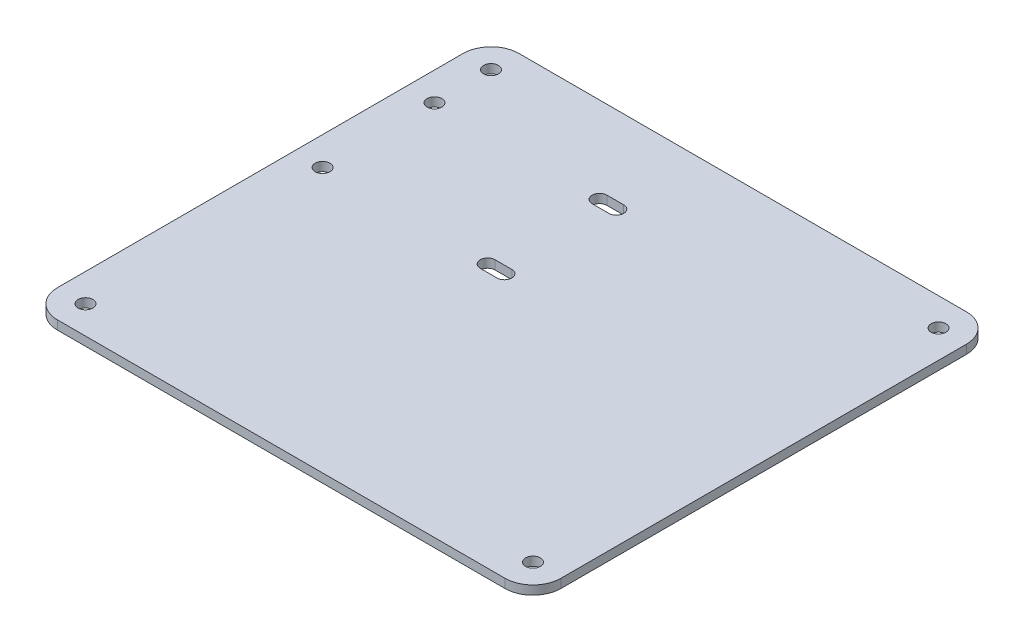
ISO-10303-21;
HEADER;
FILE_DESCRIPTION(('STEP AP214'),'2;1');
FILE_NAME('part.step','',(''),(''),'','','');
FILE_SCHEMA(('AUTOMOTIVE_DESIGN { 1 0 10303 214 1 1 1 1 }'));
ENDSEC;
DATA;
#1=APPLICATION_CONTEXT('core data for automotive mechanical design processes');
#2=APPLICATION_PROTOCOL_DEFINITION('international standard','automotive_design',2000,#1);
#3=PRODUCT_CONTEXT('',#1,'mechanical');
#4=PRODUCT('Part','Part','',(#3));
#5=PRODUCT_RELATED_PRODUCT_CATEGORY('part','',(#4));
#6=PRODUCT_DEFINITION_FORMATION('','',#4);
#7=PRODUCT_DEFINITION_CONTEXT('part definition',#1,'design');
#8=PRODUCT_DEFINITION('design','',#6,#7);
#9=PRODUCT_DEFINITION_SHAPE('','',#8);
#10=(LENGTH_UNIT() NAMED_UNIT(*) SI_UNIT(.MILLI.,.METRE.));
#11=(NAMED_UNIT(*) PLANE_ANGLE_UNIT() SI_UNIT($,.RADIAN.));
#12=(NAMED_UNIT(*) SI_UNIT($,.STERADIAN.) SOLID_ANGLE_UNIT());
#13=UNCERTAINTY_MEASURE_WITH_UNIT(LENGTH_MEASURE(1.E-05),#10,'distance_accuracy_value','');
#14=(GEOMETRIC_REPRESENTATION_CONTEXT(3) GLOBAL_UNCERTAINTY_ASSIGNED_CONTEXT((#13)) GLOBAL_UNIT_ASSIGNED_CONTEXT((#10,
#11,#12)) REPRESENTATION_CONTEXT('',''));
#15=CARTESIAN_POINT('',(0.,0.,0.));
#16=DIRECTION('',(0.,0.,1.));
#17=DIRECTION('',(1.,0.,0.));
#18=AXIS2_PLACEMENT_3D('',#15,#16,#17);
#19=CARTESIAN_POINT('',(90.,-3.175,-82.5));
#20=DIRECTION('',(1.,0.,0.));
#21=DIRECTION('',(0.,0.,-1.));
#22=AXIS2_PLACEMENT_3D('',#19,#20,#21);
#23=PLANE('',#22);
#24=DIRECTION('',(0.,0.,-1.));
#25=VECTOR('',#24,1.);
#26=CARTESIAN_POINT('',(90.,0.,-82.5));
#27=LINE('',#26,#25);
#28=CARTESIAN_POINT('',(90.,0.,72.5));
#29=VERTEX_POINT('',#28);
#30=CARTESIAN_POINT('',(90.,0.,-72.5));
#31=VERTEX_POINT('',#30);
#32=EDGE_CURVE('E256',#29,#31,#27,.T.);
#33=ORIENTED_EDGE('',*,*,#32,.F.);
#34=DIRECTION('',(0.,1.,0.));
#35=VECTOR('',#34,1.);
#36=CARTESIAN_POINT('',(90.,-3.175,72.5));
#37=LINE('',#36,#35);
#38=CARTESIAN_POINT('',(90.,-3.175,72.5));
#39=VERTEX_POINT('',#38);
#40=EDGE_CURVE('E298',#29,#39,#37,.F.);
#41=ORIENTED_EDGE('',*,*,#40,.T.);
#42=DIRECTION('',(0.,0.,-1.));
#43=VECTOR('',#42,1.);
#44=CARTESIAN_POINT('',(90.,-3.175,-82.5));
#45=LINE('',#44,#43);
#46=CARTESIAN_POINT('',(90.,-3.175,-72.5));
#47=VERTEX_POINT('',#46);
#48=EDGE_CURVE('E259',#39,#47,#45,.T.);
#49=ORIENTED_EDGE('',*,*,#48,.T.);
#50=DIRECTION('',(0.,1.,0.));
#51=VECTOR('',#50,1.);
#52=CARTESIAN_POINT('',(90.,-3.175,-72.5));
#53=LINE('',#52,#51);
#54=EDGE_CURVE('E295',#47,#31,#53,.T.);
#55=ORIENTED_EDGE('',*,*,#54,.T.);
#56=EDGE_LOOP('',(#33,#41,#49,#55));
#57=FACE_BOUND('',#56,.T.);
#58=ADVANCED_FACE('F42',(#57),#23,.T.);
#59=CARTESIAN_POINT('',(-90.,-3.175,82.5));
#60=DIRECTION('',(0.,0.,1.));
#61=DIRECTION('',(1.,0.,0.));
#62=AXIS2_PLACEMENT_3D('',#59,#60,#61);
#63=PLANE('',#62);
#64=DIRECTION('',(1.,0.,0.));
#65=VECTOR('',#64,1.);
#66=CARTESIAN_POINT('',(-90.,-3.175,82.5));
#67=LINE('',#66,#65);
#68=CARTESIAN_POINT('',(-80.,-3.175,82.5));
#69=VERTEX_POINT('',#68);
#70=CARTESIAN_POINT('',(79.9999999999999,-3.175,82.5));
#71=VERTEX_POINT('',#70);
#72=EDGE_CURVE('E269',#69,#71,#67,.T.);
#73=ORIENTED_EDGE('',*,*,#72,.T.);
#74=DIRECTION('',(0.,1.,0.));
#75=VECTOR('',#74,1.);
#76=CARTESIAN_POINT('',(80.,-3.175,82.5));
#77=LINE('',#76,#75);
#78=CARTESIAN_POINT('',(79.9999999999999,0.,82.5));
#79=VERTEX_POINT('',#78);
#80=EDGE_CURVE('E284',#71,#79,#77,.T.);
#81=ORIENTED_EDGE('',*,*,#80,.T.);
#82=DIRECTION('',(1.,0.,0.));
#83=VECTOR('',#82,1.);
#84=CARTESIAN_POINT('',(-90.,0.,82.5));
#85=LINE('',#84,#83);
#86=CARTESIAN_POINT('',(-80.,0.,82.5));
#87=VERTEX_POINT('',#86);
#88=EDGE_CURVE('E263',#87,#79,#85,.T.);
#89=ORIENTED_EDGE('',*,*,#88,.F.);
#90=DIRECTION('',(0.,1.,0.));
#91=VECTOR('',#90,1.);
#92=CARTESIAN_POINT('',(-80.,-3.175,82.5));
#93=LINE('',#92,#91);
#94=EDGE_CURVE('E272',#87,#69,#93,.F.);
#95=ORIENTED_EDGE('',*,*,#94,.T.);
#96=EDGE_LOOP('',(#73,#81,#89,#95));
#97=FACE_BOUND('',#96,.T.);
#98=ADVANCED_FACE('F336',(#97),#63,.T.);
#99=CARTESIAN_POINT('',(-90.,-3.175,-82.5));
#100=DIRECTION('',(-1.,0.,0.));
#101=DIRECTION('',(0.,0.,1.));
#102=AXIS2_PLACEMENT_3D('',#99,#100,#101);
#103=PLANE('',#102);
#104=DIRECTION('',(0.,0.,1.));
#105=VECTOR('',#104,1.);
#106=CARTESIAN_POINT('',(-90.,-3.175,-82.5));
#107=LINE('',#106,#105);
#108=CARTESIAN_POINT('',(-90.,-3.175,-72.5));
#109=VERTEX_POINT('',#108);
#110=CARTESIAN_POINT('',(-90.,-3.175,72.5));
#111=VERTEX_POINT('',#110);
#112=EDGE_CURVE('E266',#109,#111,#107,.T.);
#113=ORIENTED_EDGE('',*,*,#112,.T.);
#114=DIRECTION('',(0.,1.,0.));
#115=VECTOR('',#114,1.);
#116=CARTESIAN_POINT('',(-90.,-3.175,72.5));
#117=LINE('',#116,#115);
#118=CARTESIAN_POINT('',(-90.,0.,72.5));
#119=VERTEX_POINT('',#118);
#120=EDGE_CURVE('E310',#111,#119,#117,.T.);
#121=ORIENTED_EDGE('',*,*,#120,.T.);
#122=DIRECTION('',(0.,0.,1.));
#123=VECTOR('',#122,1.);
#124=CARTESIAN_POINT('',(-90.,0.,-82.5));
#125=LINE('',#124,#123);
#126=CARTESIAN_POINT('',(-90.,0.,-72.5));
#127=VERTEX_POINT('',#126);
#128=EDGE_CURVE('E278',#127,#119,#125,.T.);
#129=ORIENTED_EDGE('',*,*,#128,.F.);
#130=DIRECTION('',(0.,1.,0.));
#131=VECTOR('',#130,1.);
#132=CARTESIAN_POINT('',(-90.,-3.175,-72.5));
#133=LINE('',#132,#131);
#134=EDGE_CURVE('E308',#127,#109,#133,.F.);
#135=ORIENTED_EDGE('',*,*,#134,.T.);
#136=EDGE_LOOP('',(#113,#121,#129,#135));
#137=FACE_BOUND('',#136,.T.);
#138=ADVANCED_FACE('F345',(#137),#103,.T.);
#139=CARTESIAN_POINT('',(-90.,-3.175,-82.5));
#140=DIRECTION('',(0.,0.,-1.));
#141=DIRECTION('',(-1.,0.,0.));
#142=AXIS2_PLACEMENT_3D('',#139,#140,#141);
#143=PLANE('',#142);
#144=DIRECTION('',(-1.,0.,0.));
#145=VECTOR('',#144,1.);
#146=CARTESIAN_POINT('',(-90.,-3.175,-82.5));
#147=LINE('',#146,#145);
#148=CARTESIAN_POINT('',(80.,-3.175,-82.5));
#149=VERTEX_POINT('',#148);
#150=CARTESIAN_POINT('',(-80.,-3.175,-82.5));
#151=VERTEX_POINT('',#150);
#152=EDGE_CURVE('E262',#149,#151,#147,.T.);
#153=ORIENTED_EDGE('',*,*,#152,.T.);
#154=DIRECTION('',(0.,1.,0.));
#155=VECTOR('',#154,1.);
#156=CARTESIAN_POINT('',(-80.,-3.175,-82.5));
#157=LINE('',#156,#155);
#158=CARTESIAN_POINT('',(-80.,0.,-82.5));
#159=VERTEX_POINT('',#158);
#160=EDGE_CURVE('E11',#151,#159,#157,.T.);
#161=ORIENTED_EDGE('',*,*,#160,.T.);
#162=DIRECTION('',(-1.,0.,0.));
#163=VECTOR('',#162,1.);
#164=CARTESIAN_POINT('',(-90.,0.,-82.5));
#165=LINE('',#164,#163);
#166=CARTESIAN_POINT('',(80.,0.,-82.5));
#167=VERTEX_POINT('',#166);
#168=EDGE_CURVE('E275',#167,#159,#165,.T.);
#169=ORIENTED_EDGE('',*,*,#168,.F.);
#170=DIRECTION('',(0.,1.,0.));
#171=VECTOR('',#170,1.);
#172=CARTESIAN_POINT('',(80.,-3.175,-82.5));
#173=LINE('',#172,#171);
#174=EDGE_CURVE('E50',#167,#149,#173,.F.);
#175=ORIENTED_EDGE('',*,*,#174,.T.);
#176=EDGE_LOOP('',(#153,#161,#169,#175));
#177=FACE_BOUND('',#176,.T.);
#178=ADVANCED_FACE('F316',(#177),#143,.T.);
#179=CARTESIAN_POINT('',(0.,-3.175,0.));
#180=DIRECTION('',(0.,1.,0.));
#181=DIRECTION('',(0.,0.,1.));
#182=AXIS2_PLACEMENT_3D('',#179,#180,#181);
#183=PLANE('',#182);
#184=CARTESIAN_POINT('',(-79.8175000000047,-3.175,-12.1000000000044));
#185=DIRECTION('',(0.,1.,0.));
#186=DIRECTION('',(0.,0.,1.));
#187=AXIS2_PLACEMENT_3D('',#184,#185,#186);
#188=CIRCLE('',#187,2.65);
#189=CARTESIAN_POINT('',(-79.8175000000047,-3.175,-9.45000000000445));
#190=VERTEX_POINT('',#189);
#191=EDGE_CURVE('E199',#190,#190,#188,.T.);
#192=ORIENTED_EDGE('',*,*,#191,.T.);
#193=EDGE_LOOP('',(#192));
#194=FACE_BOUND('',#193,.T.);
#195=DIRECTION('',(-1.,0.,0.));
#196=VECTOR('',#195,1.);
#197=CARTESIAN_POINT('',(-20.4112500000047,-3.175,-54.3500000000041));
#198=LINE('',#197,#196);
#199=CARTESIAN_POINT('',(-14.4112500000047,-3.175,-54.3500000000041));
#200=VERTEX_POINT('',#199);
#201=CARTESIAN_POINT('',(-20.4112500000047,-3.175,-54.3500000000041));
#202=VERTEX_POINT('',#201);
#203=EDGE_CURVE('E206',#200,#202,#198,.T.);
#204=ORIENTED_EDGE('',*,*,#203,.T.);
#205=CARTESIAN_POINT('',(-20.4112500000044,-3.175,-51.7000000000041));
#206=DIRECTION('',(0.,1.,0.));
#207=DIRECTION('',(0.,0.,1.));
#208=AXIS2_PLACEMENT_3D('',#205,#206,#207);
#209=CIRCLE('',#208,2.65000000000001);
#210=CARTESIAN_POINT('',(-20.4112500000047,-3.175,-49.0500000000041));
#211=VERTEX_POINT('',#210);
#212=EDGE_CURVE('E214',#202,#211,#209,.T.);
#213=ORIENTED_EDGE('',*,*,#212,.T.);
#214=DIRECTION('',(1.,0.,0.));
#215=VECTOR('',#214,1.);
#216=CARTESIAN_POINT('',(-20.4112500000047,-3.175,-49.0500000000041));
#217=LINE('',#216,#215);
#218=CARTESIAN_POINT('',(-14.4112500000047,-3.175,-49.0500000000041));
#219=VERTEX_POINT('',#218);
#220=EDGE_CURVE('E224',#211,#219,#217,.T.);
#221=ORIENTED_EDGE('',*,*,#220,.T.);
#222=CARTESIAN_POINT('',(-14.4112500000044,-3.175,-51.7000000000041));
#223=DIRECTION('',(0.,1.,0.));
#224=DIRECTION('',(0.,0.,1.));
#225=AXIS2_PLACEMENT_3D('',#222,#223,#224);
#226=CIRCLE('',#225,2.65000000000001);
#227=EDGE_CURVE('E57',#219,#200,#226,.T.);
#228=ORIENTED_EDGE('',*,*,#227,.T.);
#229=EDGE_LOOP('',(#204,#213,#221,#228));
#230=FACE_BOUND('',#229,.T.);
#231=DIRECTION('',(-1.,0.,0.));
#232=VECTOR('',#231,1.);
#233=CARTESIAN_POINT('',(-20.4112500000047,-3.175,-14.3500000000041));
#234=LINE('',#233,#232);
#235=CARTESIAN_POINT('',(-14.4112500000047,-3.175,-14.3500000000041));
#236=VERTEX_POINT('',#235);
#237=CARTESIAN_POINT('',(-20.4112500000047,-3.175,-14.3500000000041));
#238=VERTEX_POINT('',#237);
#239=EDGE_CURVE('E187',#236,#238,#234,.T.);
#240=ORIENTED_EDGE('',*,*,#239,.T.);
#241=CARTESIAN_POINT('',(-20.4112500000047,-3.175,-11.7000000000041));
#242=DIRECTION('',(0.,1.,0.));
#243=DIRECTION('',(0.,0.,1.));
#244=AXIS2_PLACEMENT_3D('',#241,#242,#243);
#245=CIRCLE('',#244,2.65);
#246=CARTESIAN_POINT('',(-20.4112500000047,-3.175,-9.0500000000041));
#247=VERTEX_POINT('',#246);
#248=EDGE_CURVE('E161',#238,#247,#245,.T.);
#249=ORIENTED_EDGE('',*,*,#248,.T.);
#250=DIRECTION('',(1.,0.,0.));
#251=VECTOR('',#250,1.);
#252=CARTESIAN_POINT('',(-20.4112500000047,-3.175,-9.0500000000041));
#253=LINE('',#252,#251);
#254=CARTESIAN_POINT('',(-14.4112500000047,-3.175,-9.0500000000041));
#255=VERTEX_POINT('',#254);
#256=EDGE_CURVE('E191',#247,#255,#253,.T.);
#257=ORIENTED_EDGE('',*,*,#256,.T.);
#258=CARTESIAN_POINT('',(-14.4112500000047,-3.175,-11.7000000000041));
#259=DIRECTION('',(0.,1.,0.));
#260=DIRECTION('',(0.,0.,1.));
#261=AXIS2_PLACEMENT_3D('',#258,#259,#260);
#262=CIRCLE('',#261,2.65);
#263=EDGE_CURVE('E65',#255,#236,#262,.T.);
#264=ORIENTED_EDGE('',*,*,#263,.T.);
#265=EDGE_LOOP('',(#240,#249,#257,#264));
#266=FACE_BOUND('',#265,.T.);
#267=CARTESIAN_POINT('',(-79.8175000000046,-3.175,-52.1000000000045));
#268=DIRECTION('',(0.,1.,0.));
#269=DIRECTION('',(0.,0.,1.));
#270=AXIS2_PLACEMENT_3D('',#267,#268,#269);
#271=CIRCLE('',#270,2.65);
#272=CARTESIAN_POINT('',(-79.8175000000046,-3.175,-49.4500000000045));
#273=VERTEX_POINT('',#272);
#274=EDGE_CURVE('E229',#273,#273,#271,.T.);
#275=ORIENTED_EDGE('',*,*,#274,.T.);
#276=EDGE_LOOP('',(#275));
#277=FACE_BOUND('',#276,.T.);
#278=CARTESIAN_POINT('',(80.,-3.175,-72.5));
#279=DIRECTION('',(0.,1.,0.));
#280=DIRECTION('',(0.,0.,1.));
#281=AXIS2_PLACEMENT_3D('',#278,#279,#280);
#282=CIRCLE('',#281,2.65);
#283=CARTESIAN_POINT('',(80.,-3.175,-69.85));
#284=VERTEX_POINT('',#283);
#285=EDGE_CURVE('E245',#284,#284,#282,.T.);
#286=ORIENTED_EDGE('',*,*,#285,.T.);
#287=EDGE_LOOP('',(#286));
#288=FACE_BOUND('',#287,.T.);
#289=CARTESIAN_POINT('',(-80.,-3.175,72.5));
#290=DIRECTION('',(0.,1.,0.));
#291=DIRECTION('',(0.,0.,1.));
#292=AXIS2_PLACEMENT_3D('',#289,#290,#291);
#293=CIRCLE('',#292,2.65);
#294=CARTESIAN_POINT('',(-80.,-3.175,75.15));
#295=VERTEX_POINT('',#294);
#296=EDGE_CURVE('E238',#295,#295,#293,.T.);
#297=ORIENTED_EDGE('',*,*,#296,.T.);
#298=EDGE_LOOP('',(#297));
#299=FACE_BOUND('',#298,.T.);
#300=CARTESIAN_POINT('',(80.,-3.175,72.5));
#301=DIRECTION('',(0.,1.,0.));
#302=DIRECTION('',(0.,0.,1.));
#303=AXIS2_PLACEMENT_3D('',#300,#301,#302);
#304=CIRCLE('',#303,2.65);
#305=CARTESIAN_POINT('',(80.,-3.175,75.15));
#306=VERTEX_POINT('',#305);
#307=EDGE_CURVE('E232',#306,#306,#304,.T.);
#308=ORIENTED_EDGE('',*,*,#307,.T.);
#309=EDGE_LOOP('',(#308));
#310=FACE_BOUND('',#309,.T.);
#311=CARTESIAN_POINT('',(-80.,-3.175,-72.5));
#312=DIRECTION('',(0.,1.,0.));
#313=DIRECTION('',(0.,0.,1.));
#314=AXIS2_PLACEMENT_3D('',#311,#312,#313);
#315=CIRCLE('',#314,2.65);
#316=CARTESIAN_POINT('',(-80.,-3.175,-69.85));
#317=VERTEX_POINT('',#316);
#318=EDGE_CURVE('E253',#317,#317,#315,.T.);
#319=ORIENTED_EDGE('',*,*,#318,.T.);
#320=EDGE_LOOP('',(#319));
#321=FACE_BOUND('',#320,.T.);
#322=ORIENTED_EDGE('',*,*,#48,.F.);
#323=CARTESIAN_POINT('',(80.,-3.175,72.5));
#324=DIRECTION('',(0.,1.,0.));
#325=DIRECTION('',(0.,0.,1.));
#326=AXIS2_PLACEMENT_3D('',#323,#324,#325);
#327=CIRCLE('',#326,10.);
#328=EDGE_CURVE('E306',#39,#71,#327,.F.);
#329=ORIENTED_EDGE('',*,*,#328,.T.);
#330=ORIENTED_EDGE('',*,*,#72,.F.);
#331=CARTESIAN_POINT('',(-80.,-3.175,72.5));
#332=DIRECTION('',(0.,1.,0.));
#333=DIRECTION('',(0.,0.,1.));
#334=AXIS2_PLACEMENT_3D('',#331,#332,#333);
#335=CIRCLE('',#334,10.);
#336=EDGE_CURVE('E304',#69,#111,#335,.F.);
#337=ORIENTED_EDGE('',*,*,#336,.T.);
#338=ORIENTED_EDGE('',*,*,#112,.F.);
#339=CARTESIAN_POINT('',(-80.,-3.175,-72.5));
#340=DIRECTION('',(0.,1.,0.));
#341=DIRECTION('',(0.,0.,1.));
#342=AXIS2_PLACEMENT_3D('',#339,#340,#341);
#343=CIRCLE('',#342,10.);
#344=EDGE_CURVE('E302',#109,#151,#343,.F.);
#345=ORIENTED_EDGE('',*,*,#344,.T.);
#346=ORIENTED_EDGE('',*,*,#152,.F.);
#347=CARTESIAN_POINT('',(80.,-3.175,-72.5));
#348=DIRECTION('',(0.,1.,0.));
#349=DIRECTION('',(0.,0.,1.));
#350=AXIS2_PLACEMENT_3D('',#347,#348,#349);
#351=CIRCLE('',#350,10.);
#352=EDGE_CURVE('E300',#149,#47,#351,.F.);
#353=ORIENTED_EDGE('',*,*,#352,.T.);
#354=EDGE_LOOP('',(#322,#329,#330,#337,#338,#345,#346,#353));
#355=FACE_BOUND('',#354,.T.);
#356=ADVANCED_FACE('F322',(#194,#230,#266,#277,#288,#299,#310,#321,#355),#183,.F.);
#357=CARTESIAN_POINT('',(0.,0.,0.));
#358=DIRECTION('',(0.,1.,0.));
#359=DIRECTION('',(0.,0.,1.));
#360=AXIS2_PLACEMENT_3D('',#357,#358,#359);
#361=PLANE('',#360);
#362=CARTESIAN_POINT('',(-79.8175000000047,0.,-12.1000000000044));
#363=DIRECTION('',(0.,1.,0.));
#364=DIRECTION('',(0.,0.,1.));
#365=AXIS2_PLACEMENT_3D('',#362,#363,#364);
#366=CIRCLE('',#365,2.65);
#367=CARTESIAN_POINT('',(-79.8175000000047,0.,-9.45000000000445));
#368=VERTEX_POINT('',#367);
#369=EDGE_CURVE('E195',#368,#368,#366,.T.);
#370=ORIENTED_EDGE('',*,*,#369,.F.);
#371=EDGE_LOOP('',(#370));
#372=FACE_BOUND('',#371,.T.);
#373=CARTESIAN_POINT('',(-20.4112500000044,0.,-51.7000000000041));
#374=DIRECTION('',(0.,1.,0.));
#375=DIRECTION('',(0.,0.,1.));
#376=AXIS2_PLACEMENT_3D('',#373,#374,#375);
#377=CIRCLE('',#376,2.65000000000001);
#378=CARTESIAN_POINT('',(-20.4112500000047,0.,-54.3500000000041));
#379=VERTEX_POINT('',#378);
#380=CARTESIAN_POINT('',(-20.4112500000047,0.,-49.0500000000041));
#381=VERTEX_POINT('',#380);
#382=EDGE_CURVE('E202',#379,#381,#377,.T.);
#383=ORIENTED_EDGE('',*,*,#382,.F.);
#384=DIRECTION('',(-1.,0.,0.));
#385=VECTOR('',#384,1.);
#386=CARTESIAN_POINT('',(-20.4112500000047,0.,-54.3500000000041));
#387=LINE('',#386,#385);
#388=CARTESIAN_POINT('',(-14.4112500000047,0.,-54.3500000000041));
#389=VERTEX_POINT('',#388);
#390=EDGE_CURVE('E210',#389,#379,#387,.T.);
#391=ORIENTED_EDGE('',*,*,#390,.F.);
#392=CARTESIAN_POINT('',(-14.4112500000044,0.,-51.7000000000041));
#393=DIRECTION('',(0.,1.,0.));
#394=DIRECTION('',(0.,0.,1.));
#395=AXIS2_PLACEMENT_3D('',#392,#393,#394);
#396=CIRCLE('',#395,2.65000000000001);
#397=CARTESIAN_POINT('',(-14.4112500000047,0.,-49.0500000000041));
#398=VERTEX_POINT('',#397);
#399=EDGE_CURVE('E213',#398,#389,#396,.T.);
#400=ORIENTED_EDGE('',*,*,#399,.F.);
#401=DIRECTION('',(1.,0.,0.));
#402=VECTOR('',#401,1.);
#403=CARTESIAN_POINT('',(-20.4112500000047,0.,-49.0500000000041));
#404=LINE('',#403,#402);
#405=EDGE_CURVE('E217',#381,#398,#404,.T.);
#406=ORIENTED_EDGE('',*,*,#405,.F.);
#407=EDGE_LOOP('',(#383,#391,#400,#406));
#408=FACE_BOUND('',#407,.T.);
#409=CARTESIAN_POINT('',(-20.4112500000047,0.,-11.7000000000041));
#410=DIRECTION('',(0.,1.,0.));
#411=DIRECTION('',(0.,0.,1.));
#412=AXIS2_PLACEMENT_3D('',#409,#410,#411);
#413=CIRCLE('',#412,2.65);
#414=CARTESIAN_POINT('',(-20.4112500000047,0.,-14.3500000000041));
#415=VERTEX_POINT('',#414);
#416=CARTESIAN_POINT('',(-20.4112500000047,0.,-9.0500000000041));
#417=VERTEX_POINT('',#416);
#418=EDGE_CURVE('E158',#415,#417,#413,.T.);
#419=ORIENTED_EDGE('',*,*,#418,.F.);
#420=DIRECTION('',(-1.,0.,0.));
#421=VECTOR('',#420,1.);
#422=CARTESIAN_POINT('',(-20.4112500000047,0.,-14.3500000000041));
#423=LINE('',#422,#421);
#424=CARTESIAN_POINT('',(-14.4112500000047,0.,-14.3500000000041));
#425=VERTEX_POINT('',#424);
#426=EDGE_CURVE('E168',#425,#415,#423,.T.);
#427=ORIENTED_EDGE('',*,*,#426,.F.);
#428=CARTESIAN_POINT('',(-14.4112500000047,0.,-11.7000000000041));
#429=DIRECTION('',(0.,1.,0.));
#430=DIRECTION('',(0.,0.,1.));
#431=AXIS2_PLACEMENT_3D('',#428,#429,#430);
#432=CIRCLE('',#431,2.65);
#433=CARTESIAN_POINT('',(-14.4112500000047,0.,-9.0500000000041));
#434=VERTEX_POINT('',#433);
#435=EDGE_CURVE('E173',#434,#425,#432,.T.);
#436=ORIENTED_EDGE('',*,*,#435,.F.);
#437=DIRECTION('',(1.,0.,0.));
#438=VECTOR('',#437,1.);
#439=CARTESIAN_POINT('',(-20.4112500000047,0.,-9.0500000000041));
#440=LINE('',#439,#438);
#441=EDGE_CURVE('E179',#417,#434,#440,.T.);
#442=ORIENTED_EDGE('',*,*,#441,.F.);
#443=EDGE_LOOP('',(#419,#427,#436,#442));
#444=FACE_BOUND('',#443,.T.);
#445=CARTESIAN_POINT('',(-79.8175000000046,0.,-52.1000000000045));
#446=DIRECTION('',(0.,1.,0.));
#447=DIRECTION('',(0.,0.,1.));
#448=AXIS2_PLACEMENT_3D('',#445,#446,#447);
#449=CIRCLE('',#448,2.65);
#450=CARTESIAN_POINT('',(-79.8175000000046,0.,-49.4500000000045));
#451=VERTEX_POINT('',#450);
#452=EDGE_CURVE('E198',#451,#451,#449,.T.);
#453=ORIENTED_EDGE('',*,*,#452,.F.);
#454=EDGE_LOOP('',(#453));
#455=FACE_BOUND('',#454,.T.);
#456=CARTESIAN_POINT('',(80.,0.,-72.5));
#457=DIRECTION('',(0.,1.,0.));
#458=DIRECTION('',(0.,0.,1.));
#459=AXIS2_PLACEMENT_3D('',#456,#457,#458);
#460=CIRCLE('',#459,2.65);
#461=CARTESIAN_POINT('',(80.,0.,-69.85));
#462=VERTEX_POINT('',#461);
#463=EDGE_CURVE('E241',#462,#462,#460,.T.);
#464=ORIENTED_EDGE('',*,*,#463,.F.);
#465=EDGE_LOOP('',(#464));
#466=FACE_BOUND('',#465,.T.);
#467=CARTESIAN_POINT('',(-80.,0.,72.5));
#468=DIRECTION('',(0.,1.,0.));
#469=DIRECTION('',(0.,0.,1.));
#470=AXIS2_PLACEMENT_3D('',#467,#468,#469);
#471=CIRCLE('',#470,2.65);
#472=CARTESIAN_POINT('',(-80.,0.,75.15));
#473=VERTEX_POINT('',#472);
#474=EDGE_CURVE('E248',#473,#473,#471,.T.);
#475=ORIENTED_EDGE('',*,*,#474,.F.);
#476=EDGE_LOOP('',(#475));
#477=FACE_BOUND('',#476,.T.);
#478=CARTESIAN_POINT('',(80.,0.,72.5));
#479=DIRECTION('',(0.,1.,0.));
#480=DIRECTION('',(0.,0.,1.));
#481=AXIS2_PLACEMENT_3D('',#478,#479,#480);
#482=CIRCLE('',#481,2.65);
#483=CARTESIAN_POINT('',(80.,0.,75.15));
#484=VERTEX_POINT('',#483);
#485=EDGE_CURVE('E235',#484,#484,#482,.T.);
#486=ORIENTED_EDGE('',*,*,#485,.F.);
#487=EDGE_LOOP('',(#486));
#488=FACE_BOUND('',#487,.T.);
#489=CARTESIAN_POINT('',(-80.,0.,-72.5));
#490=DIRECTION('',(0.,1.,0.));
#491=DIRECTION('',(0.,0.,1.));
#492=AXIS2_PLACEMENT_3D('',#489,#490,#491);
#493=CIRCLE('',#492,2.65);
#494=CARTESIAN_POINT('',(-80.,0.,-69.85));
#495=VERTEX_POINT('',#494);
#496=EDGE_CURVE('E244',#495,#495,#493,.T.);
#497=ORIENTED_EDGE('',*,*,#496,.F.);
#498=EDGE_LOOP('',(#497));
#499=FACE_BOUND('',#498,.T.);
#500=ORIENTED_EDGE('',*,*,#88,.T.);
#501=CARTESIAN_POINT('',(80.,0.,72.5));
#502=DIRECTION('',(0.,1.,0.));
#503=DIRECTION('',(0.,0.,1.));
#504=AXIS2_PLACEMENT_3D('',#501,#502,#503);
#505=CIRCLE('',#504,10.);
#506=EDGE_CURVE('E293',#79,#29,#505,.T.);
#507=ORIENTED_EDGE('',*,*,#506,.T.);
#508=ORIENTED_EDGE('',*,*,#32,.T.);
#509=CARTESIAN_POINT('',(80.,0.,-72.5));
#510=DIRECTION('',(0.,1.,0.));
#511=DIRECTION('',(0.,0.,1.));
#512=AXIS2_PLACEMENT_3D('',#509,#510,#511);
#513=CIRCLE('',#512,10.);
#514=EDGE_CURVE('E287',#31,#167,#513,.T.);
#515=ORIENTED_EDGE('',*,*,#514,.T.);
#516=ORIENTED_EDGE('',*,*,#168,.T.);
#517=CARTESIAN_POINT('',(-80.,0.,-72.5));
#518=DIRECTION('',(0.,1.,0.));
#519=DIRECTION('',(0.,0.,1.));
#520=AXIS2_PLACEMENT_3D('',#517,#518,#519);
#521=CIRCLE('',#520,10.);
#522=EDGE_CURVE('E289',#159,#127,#521,.T.);
#523=ORIENTED_EDGE('',*,*,#522,.T.);
#524=ORIENTED_EDGE('',*,*,#128,.T.);
#525=CARTESIAN_POINT('',(-80.,0.,72.5));
#526=DIRECTION('',(0.,1.,0.));
#527=DIRECTION('',(0.,0.,1.));
#528=AXIS2_PLACEMENT_3D('',#525,#526,#527);
#529=CIRCLE('',#528,10.);
#530=EDGE_CURVE('E291',#119,#87,#529,.T.);
#531=ORIENTED_EDGE('',*,*,#530,.T.);
#532=EDGE_LOOP('',(#500,#507,#508,#515,#516,#523,#524,#531));
#533=FACE_BOUND('',#532,.T.);
#534=ADVANCED_FACE('F176',(#372,#408,#444,#455,#466,#477,#488,#499,#533),#361,.T.);
#535=CARTESIAN_POINT('',(80.,-3.175,72.5));
#536=DIRECTION('',(0.,1.,0.));
#537=DIRECTION('',(0.,0.,1.));
#538=AXIS2_PLACEMENT_3D('',#535,#536,#537);
#539=CYLINDRICAL_SURFACE('',#538,10.);
#540=ORIENTED_EDGE('',*,*,#328,.F.);
#541=ORIENTED_EDGE('',*,*,#40,.F.);
#542=ORIENTED_EDGE('',*,*,#506,.F.);
#543=ORIENTED_EDGE('',*,*,#80,.F.);
#544=EDGE_LOOP('',(#540,#541,#542,#543));
#545=FACE_BOUND('',#544,.T.);
#546=ADVANCED_FACE('F334',(#545),#539,.T.);
#547=CARTESIAN_POINT('',(-80.,-3.175,72.5));
#548=DIRECTION('',(0.,1.,0.));
#549=DIRECTION('',(0.,0.,1.));
#550=AXIS2_PLACEMENT_3D('',#547,#548,#549);
#551=CYLINDRICAL_SURFACE('',#550,10.);
#552=ORIENTED_EDGE('',*,*,#336,.F.);
#553=ORIENTED_EDGE('',*,*,#94,.F.);
#554=ORIENTED_EDGE('',*,*,#530,.F.);
#555=ORIENTED_EDGE('',*,*,#120,.F.);
#556=EDGE_LOOP('',(#552,#553,#554,#555));
#557=FACE_BOUND('',#556,.T.);
#558=ADVANCED_FACE('F342',(#557),#551,.T.);
#559=CARTESIAN_POINT('',(-80.,-3.175,-72.5));
#560=DIRECTION('',(0.,1.,0.));
#561=DIRECTION('',(0.,0.,1.));
#562=AXIS2_PLACEMENT_3D('',#559,#560,#561);
#563=CYLINDRICAL_SURFACE('',#562,10.);
#564=ORIENTED_EDGE('',*,*,#344,.F.);
#565=ORIENTED_EDGE('',*,*,#134,.F.);
#566=ORIENTED_EDGE('',*,*,#522,.F.);
#567=ORIENTED_EDGE('',*,*,#160,.F.);
#568=EDGE_LOOP('',(#564,#565,#566,#567));
#569=FACE_BOUND('',#568,.T.);
#570=ADVANCED_FACE('F348',(#569),#563,.T.);
#571=CARTESIAN_POINT('',(80.,-3.175,-72.5));
#572=DIRECTION('',(0.,1.,0.));
#573=DIRECTION('',(0.,0.,1.));
#574=AXIS2_PLACEMENT_3D('',#571,#572,#573);
#575=CYLINDRICAL_SURFACE('',#574,10.);
#576=ORIENTED_EDGE('',*,*,#352,.F.);
#577=ORIENTED_EDGE('',*,*,#174,.F.);
#578=ORIENTED_EDGE('',*,*,#514,.F.);
#579=ORIENTED_EDGE('',*,*,#54,.F.);
#580=EDGE_LOOP('',(#576,#577,#578,#579));
#581=FACE_BOUND('',#580,.T.);
#582=ADVANCED_FACE('F44',(#581),#575,.T.);
#583=CARTESIAN_POINT('',(-80.,-3.175,-72.5));
#584=DIRECTION('',(0.,1.,0.));
#585=DIRECTION('',(0.,0.,1.));
#586=AXIS2_PLACEMENT_3D('',#583,#584,#585);
#587=CYLINDRICAL_SURFACE('',#586,2.65);
#588=ORIENTED_EDGE('',*,*,#318,.F.);
#589=EDGE_LOOP('',(#588));
#590=FACE_BOUND('',#589,.T.);
#591=ORIENTED_EDGE('',*,*,#496,.T.);
#592=EDGE_LOOP('',(#591));
#593=FACE_BOUND('',#592,.T.);
#594=ADVANCED_FACE('F354',(#590,#593),#587,.F.);
#595=CARTESIAN_POINT('',(80.,-3.175,72.5));
#596=DIRECTION('',(0.,1.,0.));
#597=DIRECTION('',(0.,0.,1.));
#598=AXIS2_PLACEMENT_3D('',#595,#596,#597);
#599=CYLINDRICAL_SURFACE('',#598,2.65);
#600=ORIENTED_EDGE('',*,*,#307,.F.);
#601=EDGE_LOOP('',(#600));
#602=FACE_BOUND('',#601,.T.);
#603=ORIENTED_EDGE('',*,*,#485,.T.);
#604=EDGE_LOOP('',(#603));
#605=FACE_BOUND('',#604,.T.);
#606=ADVANCED_FACE('F434',(#602,#605),#599,.F.);
#607=CARTESIAN_POINT('',(-80.,-3.175,72.5));
#608=DIRECTION('',(0.,1.,0.));
#609=DIRECTION('',(0.,0.,1.));
#610=AXIS2_PLACEMENT_3D('',#607,#608,#609);
#611=CYLINDRICAL_SURFACE('',#610,2.65);
#612=ORIENTED_EDGE('',*,*,#296,.F.);
#613=EDGE_LOOP('',(#612));
#614=FACE_BOUND('',#613,.T.);
#615=ORIENTED_EDGE('',*,*,#474,.T.);
#616=EDGE_LOOP('',(#615));
#617=FACE_BOUND('',#616,.T.);
#618=ADVANCED_FACE('F444',(#614,#617),#611,.F.);
#619=CARTESIAN_POINT('',(80.,-3.175,-72.5));
#620=DIRECTION('',(0.,1.,0.));
#621=DIRECTION('',(0.,0.,1.));
#622=AXIS2_PLACEMENT_3D('',#619,#620,#621);
#623=CYLINDRICAL_SURFACE('',#622,2.65);
#624=ORIENTED_EDGE('',*,*,#285,.F.);
#625=EDGE_LOOP('',(#624));
#626=FACE_BOUND('',#625,.T.);
#627=ORIENTED_EDGE('',*,*,#463,.T.);
#628=EDGE_LOOP('',(#627));
#629=FACE_BOUND('',#628,.T.);
#630=ADVANCED_FACE('F455',(#626,#629),#623,.F.);
#631=CARTESIAN_POINT('',(-79.8175000000046,-3.175,-52.1000000000045));
#632=DIRECTION('',(0.,1.,0.));
#633=DIRECTION('',(0.,0.,1.));
#634=AXIS2_PLACEMENT_3D('',#631,#632,#633);
#635=CYLINDRICAL_SURFACE('',#634,2.65);
#636=ORIENTED_EDGE('',*,*,#274,.F.);
#637=EDGE_LOOP('',(#636));
#638=FACE_BOUND('',#637,.T.);
#639=ORIENTED_EDGE('',*,*,#452,.T.);
#640=EDGE_LOOP('',(#639));
#641=FACE_BOUND('',#640,.T.);
#642=ADVANCED_FACE('F465',(#638,#641),#635,.F.);
#643=CARTESIAN_POINT('',(-20.4112500000047,-3.175,-11.7000000000041));
#644=DIRECTION('',(0.,1.,0.));
#645=DIRECTION('',(0.,0.,1.));
#646=AXIS2_PLACEMENT_3D('',#643,#644,#645);
#647=CYLINDRICAL_SURFACE('',#646,2.65);
#648=ORIENTED_EDGE('',*,*,#418,.T.);
#649=DIRECTION('',(0.,1.,0.));
#650=VECTOR('',#649,1.);
#651=CARTESIAN_POINT('',(-20.4112500000047,-3.175,-9.0500000000041));
#652=LINE('',#651,#650);
#653=EDGE_CURVE('E189',#247,#417,#652,.T.);
#654=ORIENTED_EDGE('',*,*,#653,.F.);
#655=ORIENTED_EDGE('',*,*,#248,.F.);
#656=DIRECTION('',(0.,1.,0.));
#657=VECTOR('',#656,1.);
#658=CARTESIAN_POINT('',(-20.4112500000047,-3.175,-14.3500000000041));
#659=LINE('',#658,#657);
#660=EDGE_CURVE('E154',#238,#415,#659,.T.);
#661=ORIENTED_EDGE('',*,*,#660,.T.);
#662=EDGE_LOOP('',(#648,#654,#655,#661));
#663=FACE_BOUND('',#662,.T.);
#664=ADVANCED_FACE('F156',(#663),#647,.F.);
#665=CARTESIAN_POINT('',(-20.4112500000047,-3.175,-14.3500000000041));
#666=DIRECTION('',(0.,0.,-1.));
#667=DIRECTION('',(-1.,0.,0.));
#668=AXIS2_PLACEMENT_3D('',#665,#666,#667);
#669=PLANE('',#668);
#670=ORIENTED_EDGE('',*,*,#426,.T.);
#671=ORIENTED_EDGE('',*,*,#660,.F.);
#672=ORIENTED_EDGE('',*,*,#239,.F.);
#673=DIRECTION('',(0.,1.,0.));
#674=VECTOR('',#673,1.);
#675=CARTESIAN_POINT('',(-14.4112500000047,-3.175,-14.3500000000041));
#676=LINE('',#675,#674);
#677=EDGE_CURVE('E165',#236,#425,#676,.T.);
#678=ORIENTED_EDGE('',*,*,#677,.T.);
#679=EDGE_LOOP('',(#670,#671,#672,#678));
#680=FACE_BOUND('',#679,.T.);
#681=ADVANCED_FACE('F169',(#680),#669,.F.);
#682=CARTESIAN_POINT('',(-14.4112500000047,-3.175,-11.7000000000041));
#683=DIRECTION('',(0.,1.,0.));
#684=DIRECTION('',(0.,0.,1.));
#685=AXIS2_PLACEMENT_3D('',#682,#683,#684);
#686=CYLINDRICAL_SURFACE('',#685,2.65);
#687=ORIENTED_EDGE('',*,*,#435,.T.);
#688=ORIENTED_EDGE('',*,*,#677,.F.);
#689=ORIENTED_EDGE('',*,*,#263,.F.);
#690=DIRECTION('',(0.,1.,0.));
#691=VECTOR('',#690,1.);
#692=CARTESIAN_POINT('',(-14.4112500000047,-3.175,-9.0500000000041));
#693=LINE('',#692,#691);
#694=EDGE_CURVE('E635',#255,#434,#693,.T.);
#695=ORIENTED_EDGE('',*,*,#694,.T.);
#696=EDGE_LOOP('',(#687,#688,#689,#695));
#697=FACE_BOUND('',#696,.T.);
#698=ADVANCED_FACE('F494',(#697),#686,.F.);
#699=CARTESIAN_POINT('',(-20.4112500000047,-3.175,-9.0500000000041));
#700=DIRECTION('',(0.,0.,1.));
#701=DIRECTION('',(1.,0.,0.));
#702=AXIS2_PLACEMENT_3D('',#699,#700,#701);
#703=PLANE('',#702);
#704=ORIENTED_EDGE('',*,*,#441,.T.);
#705=ORIENTED_EDGE('',*,*,#694,.F.);
#706=ORIENTED_EDGE('',*,*,#256,.F.);
#707=ORIENTED_EDGE('',*,*,#653,.T.);
#708=EDGE_LOOP('',(#704,#705,#706,#707));
#709=FACE_BOUND('',#708,.T.);
#710=ADVANCED_FACE('F504',(#709),#703,.F.);
#711=CARTESIAN_POINT('',(-20.4112500000044,-3.175,-51.7000000000041));
#712=DIRECTION('',(0.,1.,0.));
#713=DIRECTION('',(0.,0.,1.));
#714=AXIS2_PLACEMENT_3D('',#711,#712,#713);
#715=CYLINDRICAL_SURFACE('',#714,2.65000000000001);
#716=ORIENTED_EDGE('',*,*,#382,.T.);
#717=DIRECTION('',(0.,1.,0.));
#718=VECTOR('',#717,1.);
#719=CARTESIAN_POINT('',(-20.4112500000047,-3.175,-49.0500000000041));
#720=LINE('',#719,#718);
#721=EDGE_CURVE('E203',#211,#381,#720,.T.);
#722=ORIENTED_EDGE('',*,*,#721,.F.);
#723=ORIENTED_EDGE('',*,*,#212,.F.);
#724=DIRECTION('',(0.,1.,0.));
#725=VECTOR('',#724,1.);
#726=CARTESIAN_POINT('',(-20.4112500000047,-3.175,-54.3500000000041));
#727=LINE('',#726,#725);
#728=EDGE_CURVE('E180',#202,#379,#727,.T.);
#729=ORIENTED_EDGE('',*,*,#728,.T.);
#730=EDGE_LOOP('',(#716,#722,#723,#729));
#731=FACE_BOUND('',#730,.T.);
#732=ADVANCED_FACE('F514',(#731),#715,.F.);
#733=CARTESIAN_POINT('',(-20.4112500000047,-3.175,-54.3500000000041));
#734=DIRECTION('',(0.,0.,-1.));
#735=DIRECTION('',(-1.,0.,0.));
#736=AXIS2_PLACEMENT_3D('',#733,#734,#735);
#737=PLANE('',#736);
#738=ORIENTED_EDGE('',*,*,#390,.T.);
#739=ORIENTED_EDGE('',*,*,#728,.F.);
#740=ORIENTED_EDGE('',*,*,#203,.F.);
#741=DIRECTION('',(0.,1.,0.));
#742=VECTOR('',#741,1.);
#743=CARTESIAN_POINT('',(-14.4112500000047,-3.175,-54.3500000000041));
#744=LINE('',#743,#742);
#745=EDGE_CURVE('E182',#200,#389,#744,.T.);
#746=ORIENTED_EDGE('',*,*,#745,.T.);
#747=EDGE_LOOP('',(#738,#739,#740,#746));
#748=FACE_BOUND('',#747,.T.);
#749=ADVANCED_FACE('F525',(#748),#737,.F.);
#750=CARTESIAN_POINT('',(-14.4112500000044,-3.175,-51.7000000000041));
#751=DIRECTION('',(0.,1.,0.));
#752=DIRECTION('',(0.,0.,1.));
#753=AXIS2_PLACEMENT_3D('',#750,#751,#752);
#754=CYLINDRICAL_SURFACE('',#753,2.65000000000001);
#755=ORIENTED_EDGE('',*,*,#399,.T.);
#756=ORIENTED_EDGE('',*,*,#745,.F.);
#757=ORIENTED_EDGE('',*,*,#227,.F.);
#758=DIRECTION('',(0.,1.,0.));
#759=VECTOR('',#758,1.);
#760=CARTESIAN_POINT('',(-14.4112500000047,-3.175,-49.0500000000041));
#761=LINE('',#760,#759);
#762=EDGE_CURVE('E207',#219,#398,#761,.T.);
#763=ORIENTED_EDGE('',*,*,#762,.T.);
#764=EDGE_LOOP('',(#755,#756,#757,#763));
#765=FACE_BOUND('',#764,.T.);
#766=ADVANCED_FACE('F536',(#765),#754,.F.);
#767=CARTESIAN_POINT('',(-20.4112500000047,-3.175,-49.0500000000041));
#768=DIRECTION('',(0.,0.,1.));
#769=DIRECTION('',(1.,0.,0.));
#770=AXIS2_PLACEMENT_3D('',#767,#768,#769);
#771=PLANE('',#770);
#772=ORIENTED_EDGE('',*,*,#405,.T.);
#773=ORIENTED_EDGE('',*,*,#762,.F.);
#774=ORIENTED_EDGE('',*,*,#220,.F.);
#775=ORIENTED_EDGE('',*,*,#721,.T.);
#776=EDGE_LOOP('',(#772,#773,#774,#775));
#777=FACE_BOUND('',#776,.T.);
#778=ADVANCED_FACE('F547',(#777),#771,.F.);
#779=CARTESIAN_POINT('',(-79.8175000000047,-3.175,-12.1000000000044));
#780=DIRECTION('',(0.,1.,0.));
#781=DIRECTION('',(0.,0.,1.));
#782=AXIS2_PLACEMENT_3D('',#779,#780,#781);
#783=CYLINDRICAL_SURFACE('',#782,2.65);
#784=ORIENTED_EDGE('',*,*,#191,.F.);
#785=EDGE_LOOP('',(#784));
#786=FACE_BOUND('',#785,.T.);
#787=ORIENTED_EDGE('',*,*,#369,.T.);
#788=EDGE_LOOP('',(#787));
#789=FACE_BOUND('',#788,.T.);
#790=ADVANCED_FACE('F557',(#786,#789),#783,.F.);
#791=CLOSED_SHELL('',(#58,#98,#138,#178,#356,#534,#546,#558,#570,#582,#594,#606,#618,#630,#642,
#664,#681,#698,#710,#732,#749,#766,#778,#790));
#792=MANIFOLD_SOLID_BREP('B2',#791);
#793=ADVANCED_BREP_SHAPE_REPRESENTATION('',(#18,#792),#14);
#794=SHAPE_DEFINITION_REPRESENTATION(#9,#793);
ENDSEC;
END-ISO-10303-21;
